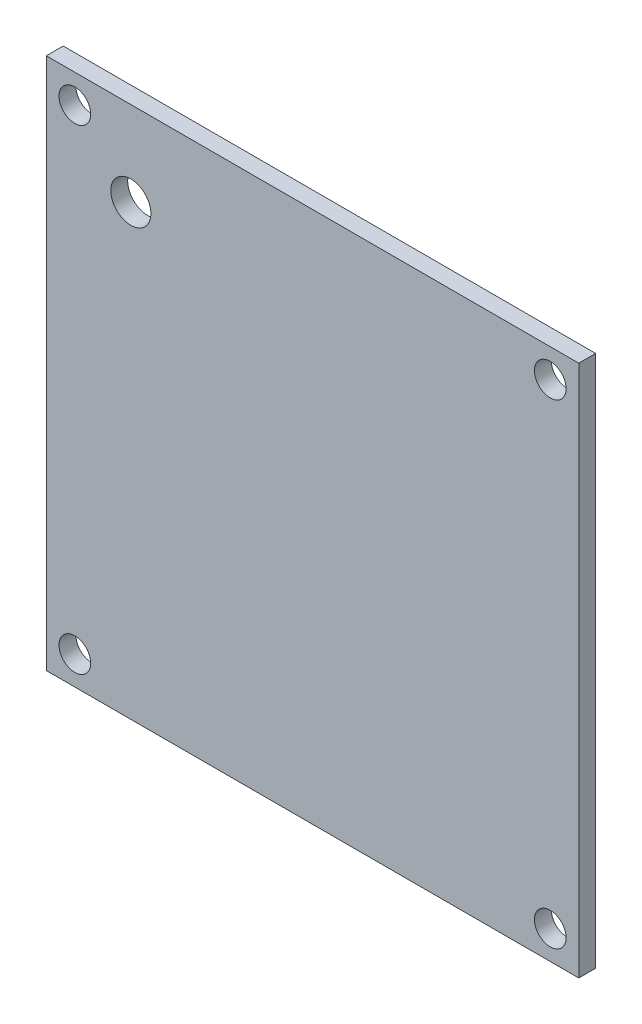
ISO-10303-21;
HEADER;
FILE_DESCRIPTION(('STEP AP214'),'2;1');
FILE_NAME('part.step','',(''),(''),'','','');
FILE_SCHEMA(('AUTOMOTIVE_DESIGN { 1 0 10303 214 1 1 1 1 }'));
ENDSEC;
DATA;
#1=APPLICATION_CONTEXT('core data for automotive mechanical design processes');
#2=APPLICATION_PROTOCOL_DEFINITION('international standard','automotive_design',2000,#1);
#3=PRODUCT_CONTEXT('',#1,'mechanical');
#4=PRODUCT('Part','Part','',(#3));
#5=PRODUCT_RELATED_PRODUCT_CATEGORY('part','',(#4));
#6=PRODUCT_DEFINITION_FORMATION('','',#4);
#7=PRODUCT_DEFINITION_CONTEXT('part definition',#1,'design');
#8=PRODUCT_DEFINITION('design','',#6,#7);
#9=PRODUCT_DEFINITION_SHAPE('','',#8);
#10=(LENGTH_UNIT() NAMED_UNIT(*) SI_UNIT(.MILLI.,.METRE.));
#11=(NAMED_UNIT(*) PLANE_ANGLE_UNIT() SI_UNIT($,.RADIAN.));
#12=(NAMED_UNIT(*) SI_UNIT($,.STERADIAN.) SOLID_ANGLE_UNIT());
#13=UNCERTAINTY_MEASURE_WITH_UNIT(LENGTH_MEASURE(1.E-05),#10,'distance_accuracy_value','');
#14=(GEOMETRIC_REPRESENTATION_CONTEXT(3) GLOBAL_UNCERTAINTY_ASSIGNED_CONTEXT((#13)) GLOBAL_UNIT_ASSIGNED_CONTEXT((#10,
#11,#12)) REPRESENTATION_CONTEXT('',''));
#15=CARTESIAN_POINT('',(0.,0.,0.));
#16=DIRECTION('',(0.,0.,1.));
#17=DIRECTION('',(1.,0.,0.));
#18=AXIS2_PLACEMENT_3D('',#15,#16,#17);
#19=CARTESIAN_POINT('',(0.,0.,0.));
#20=DIRECTION('',(0.,0.,-1.));
#21=DIRECTION('',(-1.,0.,0.));
#22=AXIS2_PLACEMENT_3D('',#19,#20,#21);
#23=PLANE('',#22);
#24=DIRECTION('',(1.,0.,0.));
#25=VECTOR('',#24,1.);
#26=CARTESIAN_POINT('',(25.2,-25.2,0.));
#27=LINE('',#26,#25);
#28=CARTESIAN_POINT('',(-25.2,-25.2,0.));
#29=VERTEX_POINT('',#28);
#30=CARTESIAN_POINT('',(25.2,-25.2,0.));
#31=VERTEX_POINT('',#30);
#32=EDGE_CURVE('E58',#29,#31,#27,.T.);
#33=ORIENTED_EDGE('',*,*,#32,.F.);
#34=DIRECTION('',(0.,-1.,0.));
#35=VECTOR('',#34,1.);
#36=CARTESIAN_POINT('',(-25.2,-25.2,0.));
#37=LINE('',#36,#35);
#38=CARTESIAN_POINT('',(-25.2,25.2,0.));
#39=VERTEX_POINT('',#38);
#40=EDGE_CURVE('E53',#39,#29,#37,.T.);
#41=ORIENTED_EDGE('',*,*,#40,.F.);
#42=DIRECTION('',(-1.,0.,0.));
#43=VECTOR('',#42,1.);
#44=CARTESIAN_POINT('',(-25.2,25.2,0.));
#45=LINE('',#44,#43);
#46=CARTESIAN_POINT('',(25.2,25.2,0.));
#47=VERTEX_POINT('',#46);
#48=EDGE_CURVE('E71',#47,#39,#45,.T.);
#49=ORIENTED_EDGE('',*,*,#48,.F.);
#50=DIRECTION('',(0.,1.,0.));
#51=VECTOR('',#50,1.);
#52=CARTESIAN_POINT('',(25.2,25.2,0.));
#53=LINE('',#52,#51);
#54=EDGE_CURVE('E67',#31,#47,#53,.T.);
#55=ORIENTED_EDGE('',*,*,#54,.F.);
#56=EDGE_LOOP('',(#33,#41,#49,#55));
#57=FACE_BOUND('',#56,.T.);
#58=CARTESIAN_POINT('',(22.5,22.5,0.));
#59=DIRECTION('',(0.,0.,-1.));
#60=DIRECTION('',(-1.,0.,0.));
#61=AXIS2_PLACEMENT_3D('',#58,#59,#60);
#62=CIRCLE('',#61,1.5);
#63=CARTESIAN_POINT('',(21.,22.5,0.));
#64=VERTEX_POINT('',#63);
#65=EDGE_CURVE('E75',#64,#64,#62,.F.);
#66=ORIENTED_EDGE('',*,*,#65,.T.);
#67=EDGE_LOOP('',(#66));
#68=FACE_BOUND('',#67,.T.);
#69=CARTESIAN_POINT('',(22.5,-22.5,0.));
#70=DIRECTION('',(0.,0.,-1.));
#71=DIRECTION('',(-1.,0.,0.));
#72=AXIS2_PLACEMENT_3D('',#69,#70,#71);
#73=CIRCLE('',#72,1.5);
#74=CARTESIAN_POINT('',(21.,-22.5,0.));
#75=VERTEX_POINT('',#74);
#76=EDGE_CURVE('E102',#75,#75,#73,.F.);
#77=ORIENTED_EDGE('',*,*,#76,.T.);
#78=EDGE_LOOP('',(#77));
#79=FACE_BOUND('',#78,.T.);
#80=CARTESIAN_POINT('',(-22.5,-22.5,0.));
#81=DIRECTION('',(0.,0.,-1.));
#82=DIRECTION('',(-1.,0.,0.));
#83=AXIS2_PLACEMENT_3D('',#80,#81,#82);
#84=CIRCLE('',#83,1.5);
#85=CARTESIAN_POINT('',(-24.,-22.5,0.));
#86=VERTEX_POINT('',#85);
#87=EDGE_CURVE('E105',#86,#86,#84,.F.);
#88=ORIENTED_EDGE('',*,*,#87,.T.);
#89=EDGE_LOOP('',(#88));
#90=FACE_BOUND('',#89,.T.);
#91=CARTESIAN_POINT('',(-22.5,22.5,0.));
#92=DIRECTION('',(0.,0.,-1.));
#93=DIRECTION('',(-1.,0.,0.));
#94=AXIS2_PLACEMENT_3D('',#91,#92,#93);
#95=CIRCLE('',#94,1.5);
#96=CARTESIAN_POINT('',(-24.,22.5,0.));
#97=VERTEX_POINT('',#96);
#98=EDGE_CURVE('E107',#97,#97,#95,.F.);
#99=ORIENTED_EDGE('',*,*,#98,.T.);
#100=EDGE_LOOP('',(#99));
#101=FACE_BOUND('',#100,.T.);
#102=CARTESIAN_POINT('',(-17.2,17.2,0.));
#103=DIRECTION('',(0.,0.,-1.));
#104=DIRECTION('',(-1.,0.,0.));
#105=AXIS2_PLACEMENT_3D('',#102,#103,#104);
#106=CIRCLE('',#105,1.9);
#107=CARTESIAN_POINT('',(-19.1,17.2,0.));
#108=VERTEX_POINT('',#107);
#109=EDGE_CURVE('E20',#108,#108,#106,.F.);
#110=ORIENTED_EDGE('',*,*,#109,.T.);
#111=EDGE_LOOP('',(#110));
#112=FACE_BOUND('',#111,.T.);
#113=ADVANCED_FACE('F17',(#57,#68,#79,#90,#101,#112),#23,.T.);
#114=CARTESIAN_POINT('',(-17.2,17.2,1.6));
#115=DIRECTION('',(0.,0.,-1.));
#116=DIRECTION('',(-1.,0.,0.));
#117=AXIS2_PLACEMENT_3D('',#114,#115,#116);
#118=CYLINDRICAL_SURFACE('',#117,1.9);
#119=CARTESIAN_POINT('',(-17.2,17.2,1.6));
#120=DIRECTION('',(0.,0.,-1.));
#121=DIRECTION('',(-1.,0.,0.));
#122=AXIS2_PLACEMENT_3D('',#119,#120,#121);
#123=CIRCLE('',#122,1.9);
#124=CARTESIAN_POINT('',(-19.1,17.2,1.6));
#125=VERTEX_POINT('',#124);
#126=EDGE_CURVE('E96',#125,#125,#123,.F.);
#127=ORIENTED_EDGE('',*,*,#126,.T.);
#128=EDGE_LOOP('',(#127));
#129=FACE_BOUND('',#128,.T.);
#130=ORIENTED_EDGE('',*,*,#109,.F.);
#131=EDGE_LOOP('',(#130));
#132=FACE_BOUND('',#131,.T.);
#133=ADVANCED_FACE('F115',(#129,#132),#118,.F.);
#134=CARTESIAN_POINT('',(-22.5,22.5,1.6));
#135=DIRECTION('',(0.,0.,-1.));
#136=DIRECTION('',(-1.,0.,0.));
#137=AXIS2_PLACEMENT_3D('',#134,#135,#136);
#138=CYLINDRICAL_SURFACE('',#137,1.5);
#139=CARTESIAN_POINT('',(-22.5,22.5,1.6));
#140=DIRECTION('',(0.,0.,-1.));
#141=DIRECTION('',(-1.,0.,0.));
#142=AXIS2_PLACEMENT_3D('',#139,#140,#141);
#143=CIRCLE('',#142,1.5);
#144=CARTESIAN_POINT('',(-24.,22.5,1.6));
#145=VERTEX_POINT('',#144);
#146=EDGE_CURVE('E93',#145,#145,#143,.F.);
#147=ORIENTED_EDGE('',*,*,#146,.T.);
#148=EDGE_LOOP('',(#147));
#149=FACE_BOUND('',#148,.T.);
#150=ORIENTED_EDGE('',*,*,#98,.F.);
#151=EDGE_LOOP('',(#150));
#152=FACE_BOUND('',#151,.T.);
#153=ADVANCED_FACE('F117',(#149,#152),#138,.F.);
#154=CARTESIAN_POINT('',(-22.5,-22.5,1.6));
#155=DIRECTION('',(0.,0.,-1.));
#156=DIRECTION('',(-1.,0.,0.));
#157=AXIS2_PLACEMENT_3D('',#154,#155,#156);
#158=CYLINDRICAL_SURFACE('',#157,1.5);
#159=CARTESIAN_POINT('',(-22.5,-22.5,1.6));
#160=DIRECTION('',(0.,0.,-1.));
#161=DIRECTION('',(-1.,0.,0.));
#162=AXIS2_PLACEMENT_3D('',#159,#160,#161);
#163=CIRCLE('',#162,1.5);
#164=CARTESIAN_POINT('',(-24.,-22.5,1.6));
#165=VERTEX_POINT('',#164);
#166=EDGE_CURVE('E90',#165,#165,#163,.F.);
#167=ORIENTED_EDGE('',*,*,#166,.T.);
#168=EDGE_LOOP('',(#167));
#169=FACE_BOUND('',#168,.T.);
#170=ORIENTED_EDGE('',*,*,#87,.F.);
#171=EDGE_LOOP('',(#170));
#172=FACE_BOUND('',#171,.T.);
#173=ADVANCED_FACE('F124',(#169,#172),#158,.F.);
#174=CARTESIAN_POINT('',(22.5,-22.5,1.6));
#175=DIRECTION('',(0.,0.,-1.));
#176=DIRECTION('',(-1.,0.,0.));
#177=AXIS2_PLACEMENT_3D('',#174,#175,#176);
#178=CYLINDRICAL_SURFACE('',#177,1.5);
#179=CARTESIAN_POINT('',(22.5,-22.5,1.6));
#180=DIRECTION('',(0.,0.,-1.));
#181=DIRECTION('',(-1.,0.,0.));
#182=AXIS2_PLACEMENT_3D('',#179,#180,#181);
#183=CIRCLE('',#182,1.5);
#184=CARTESIAN_POINT('',(21.,-22.5,1.6));
#185=VERTEX_POINT('',#184);
#186=EDGE_CURVE('E87',#185,#185,#183,.F.);
#187=ORIENTED_EDGE('',*,*,#186,.T.);
#188=EDGE_LOOP('',(#187));
#189=FACE_BOUND('',#188,.T.);
#190=ORIENTED_EDGE('',*,*,#76,.F.);
#191=EDGE_LOOP('',(#190));
#192=FACE_BOUND('',#191,.T.);
#193=ADVANCED_FACE('F149',(#189,#192),#178,.F.);
#194=CARTESIAN_POINT('',(22.5,22.5,1.6));
#195=DIRECTION('',(0.,0.,-1.));
#196=DIRECTION('',(-1.,0.,0.));
#197=AXIS2_PLACEMENT_3D('',#194,#195,#196);
#198=CYLINDRICAL_SURFACE('',#197,1.5);
#199=CARTESIAN_POINT('',(22.5,22.5,1.6));
#200=DIRECTION('',(0.,0.,-1.));
#201=DIRECTION('',(-1.,0.,0.));
#202=AXIS2_PLACEMENT_3D('',#199,#200,#201);
#203=CIRCLE('',#202,1.5);
#204=CARTESIAN_POINT('',(21.,22.5,1.6));
#205=VERTEX_POINT('',#204);
#206=EDGE_CURVE('E84',#205,#205,#203,.F.);
#207=ORIENTED_EDGE('',*,*,#206,.T.);
#208=EDGE_LOOP('',(#207));
#209=FACE_BOUND('',#208,.T.);
#210=ORIENTED_EDGE('',*,*,#65,.F.);
#211=EDGE_LOOP('',(#210));
#212=FACE_BOUND('',#211,.T.);
#213=ADVANCED_FACE('F146',(#209,#212),#198,.F.);
#214=CARTESIAN_POINT('',(25.2,25.2,1.6));
#215=DIRECTION('',(1.,0.,0.));
#216=DIRECTION('',(0.,1.,0.));
#217=AXIS2_PLACEMENT_3D('',#214,#215,#216);
#218=PLANE('',#217);
#219=DIRECTION('',(0.,1.,0.));
#220=VECTOR('',#219,1.);
#221=CARTESIAN_POINT('',(25.2,0.,1.6));
#222=LINE('',#221,#220);
#223=CARTESIAN_POINT('',(25.2,25.2,1.6));
#224=VERTEX_POINT('',#223);
#225=CARTESIAN_POINT('',(25.2,-25.2,1.6));
#226=VERTEX_POINT('',#225);
#227=EDGE_CURVE('E79',#224,#226,#222,.F.);
#228=ORIENTED_EDGE('',*,*,#227,.T.);
#229=DIRECTION('',(0.,0.,1.));
#230=VECTOR('',#229,1.);
#231=CARTESIAN_POINT('',(25.2,-25.2,1.6));
#232=LINE('',#231,#230);
#233=EDGE_CURVE('E63',#31,#226,#232,.T.);
#234=ORIENTED_EDGE('',*,*,#233,.F.);
#235=ORIENTED_EDGE('',*,*,#54,.T.);
#236=DIRECTION('',(0.,0.,1.));
#237=VECTOR('',#236,1.);
#238=CARTESIAN_POINT('',(25.2,25.2,1.6));
#239=LINE('',#238,#237);
#240=EDGE_CURVE('E99',#224,#47,#239,.F.);
#241=ORIENTED_EDGE('',*,*,#240,.F.);
#242=EDGE_LOOP('',(#228,#234,#235,#241));
#243=FACE_BOUND('',#242,.T.);
#244=ADVANCED_FACE('F78',(#243),#218,.T.);
#245=CARTESIAN_POINT('',(25.2,-25.2,1.6));
#246=DIRECTION('',(0.,-1.,0.));
#247=DIRECTION('',(1.,0.,0.));
#248=AXIS2_PLACEMENT_3D('',#245,#246,#247);
#249=PLANE('',#248);
#250=DIRECTION('',(-1.,0.,0.));
#251=VECTOR('',#250,1.);
#252=CARTESIAN_POINT('',(0.,-25.2,1.6));
#253=LINE('',#252,#251);
#254=CARTESIAN_POINT('',(-25.2,-25.2,1.6));
#255=VERTEX_POINT('',#254);
#256=EDGE_CURVE('E244',#226,#255,#253,.T.);
#257=ORIENTED_EDGE('',*,*,#256,.T.);
#258=DIRECTION('',(0.,0.,1.));
#259=VECTOR('',#258,1.);
#260=CARTESIAN_POINT('',(-25.2,-25.2,1.6));
#261=LINE('',#260,#259);
#262=EDGE_CURVE('E65',#29,#255,#261,.T.);
#263=ORIENTED_EDGE('',*,*,#262,.F.);
#264=ORIENTED_EDGE('',*,*,#32,.T.);
#265=ORIENTED_EDGE('',*,*,#233,.T.);
#266=EDGE_LOOP('',(#257,#263,#264,#265));
#267=FACE_BOUND('',#266,.T.);
#268=ADVANCED_FACE('F61',(#267),#249,.T.);
#269=CARTESIAN_POINT('',(-25.2,-25.2,1.6));
#270=DIRECTION('',(-1.,0.,0.));
#271=DIRECTION('',(0.,-1.,0.));
#272=AXIS2_PLACEMENT_3D('',#269,#270,#271);
#273=PLANE('',#272);
#274=DIRECTION('',(0.,1.,0.));
#275=VECTOR('',#274,1.);
#276=CARTESIAN_POINT('',(-25.2,0.,1.6));
#277=LINE('',#276,#275);
#278=CARTESIAN_POINT('',(-25.2,25.2,1.6));
#279=VERTEX_POINT('',#278);
#280=EDGE_CURVE('E26',#255,#279,#277,.T.);
#281=ORIENTED_EDGE('',*,*,#280,.T.);
#282=DIRECTION('',(0.,0.,1.));
#283=VECTOR('',#282,1.);
#284=CARTESIAN_POINT('',(-25.2,25.2,1.6));
#285=LINE('',#284,#283);
#286=EDGE_CURVE('E34',#39,#279,#285,.T.);
#287=ORIENTED_EDGE('',*,*,#286,.F.);
#288=ORIENTED_EDGE('',*,*,#40,.T.);
#289=ORIENTED_EDGE('',*,*,#262,.T.);
#290=EDGE_LOOP('',(#281,#287,#288,#289));
#291=FACE_BOUND('',#290,.T.);
#292=ADVANCED_FACE('F135',(#291),#273,.T.);
#293=CARTESIAN_POINT('',(-25.2,25.2,1.6));
#294=DIRECTION('',(0.,1.,0.));
#295=DIRECTION('',(-1.,0.,0.));
#296=AXIS2_PLACEMENT_3D('',#293,#294,#295);
#297=PLANE('',#296);
#298=DIRECTION('',(-1.,0.,0.));
#299=VECTOR('',#298,1.);
#300=CARTESIAN_POINT('',(0.,25.2,1.6));
#301=LINE('',#300,#299);
#302=EDGE_CURVE('E11',#279,#224,#301,.F.);
#303=ORIENTED_EDGE('',*,*,#302,.T.);
#304=ORIENTED_EDGE('',*,*,#240,.T.);
#305=ORIENTED_EDGE('',*,*,#48,.T.);
#306=ORIENTED_EDGE('',*,*,#286,.T.);
#307=EDGE_LOOP('',(#303,#304,#305,#306));
#308=FACE_BOUND('',#307,.T.);
#309=ADVANCED_FACE('F129',(#308),#297,.T.);
#310=CARTESIAN_POINT('',(0.,0.,1.6));
#311=DIRECTION('',(0.,0.,-1.));
#312=DIRECTION('',(-1.,0.,0.));
#313=AXIS2_PLACEMENT_3D('',#310,#311,#312);
#314=PLANE('',#313);
#315=ORIENTED_EDGE('',*,*,#280,.F.);
#316=ORIENTED_EDGE('',*,*,#256,.F.);
#317=ORIENTED_EDGE('',*,*,#227,.F.);
#318=ORIENTED_EDGE('',*,*,#302,.F.);
#319=EDGE_LOOP('',(#315,#316,#317,#318));
#320=FACE_BOUND('',#319,.T.);
#321=ORIENTED_EDGE('',*,*,#206,.F.);
#322=EDGE_LOOP('',(#321));
#323=FACE_BOUND('',#322,.T.);
#324=ORIENTED_EDGE('',*,*,#186,.F.);
#325=EDGE_LOOP('',(#324));
#326=FACE_BOUND('',#325,.T.);
#327=ORIENTED_EDGE('',*,*,#166,.F.);
#328=EDGE_LOOP('',(#327));
#329=FACE_BOUND('',#328,.T.);
#330=ORIENTED_EDGE('',*,*,#146,.F.);
#331=EDGE_LOOP('',(#330));
#332=FACE_BOUND('',#331,.T.);
#333=ORIENTED_EDGE('',*,*,#126,.F.);
#334=EDGE_LOOP('',(#333));
#335=FACE_BOUND('',#334,.T.);
#336=ADVANCED_FACE('F127',(#320,#323,#326,#329,#332,#335),#314,.F.);
#337=CLOSED_SHELL('',(#113,#133,#153,#173,#193,#213,#244,#268,#292,#309,#336));
#338=MANIFOLD_SOLID_BREP('B1',#337);
#339=ADVANCED_BREP_SHAPE_REPRESENTATION('',(#18,#338),#14);
#340=SHAPE_DEFINITION_REPRESENTATION(#9,#339);
ENDSEC;
END-ISO-10303-21;
